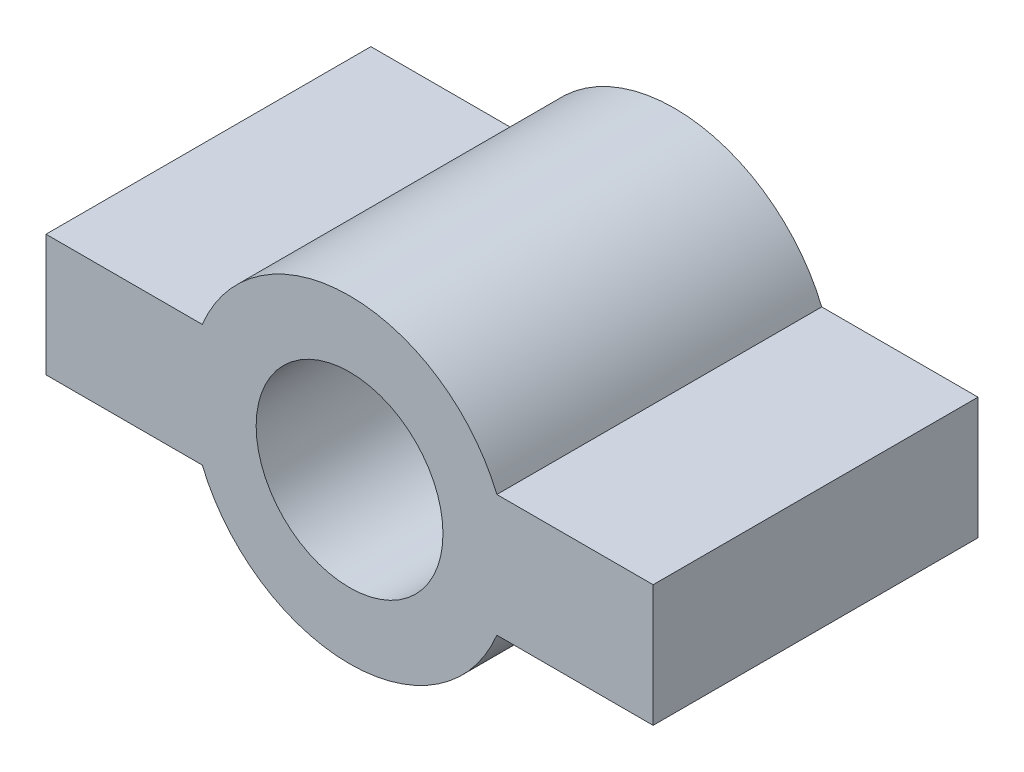
ISO-10303-21;
HEADER;
FILE_DESCRIPTION(('STEP AP214'),'2;1');
FILE_NAME('part.step','',(''),(''),'','','');
FILE_SCHEMA(('AUTOMOTIVE_DESIGN { 1 0 10303 214 1 1 1 1 }'));
ENDSEC;
DATA;
#1=APPLICATION_CONTEXT('core data for automotive mechanical design processes');
#2=APPLICATION_PROTOCOL_DEFINITION('international standard','automotive_design',2000,#1);
#3=PRODUCT_CONTEXT('',#1,'mechanical');
#4=PRODUCT('Part','Part','',(#3));
#5=PRODUCT_RELATED_PRODUCT_CATEGORY('part','',(#4));
#6=PRODUCT_DEFINITION_FORMATION('','',#4);
#7=PRODUCT_DEFINITION_CONTEXT('part definition',#1,'design');
#8=PRODUCT_DEFINITION('design','',#6,#7);
#9=PRODUCT_DEFINITION_SHAPE('','',#8);
#10=(LENGTH_UNIT() NAMED_UNIT(*) SI_UNIT(.MILLI.,.METRE.));
#11=(NAMED_UNIT(*) PLANE_ANGLE_UNIT() SI_UNIT($,.RADIAN.));
#12=(NAMED_UNIT(*) SI_UNIT($,.STERADIAN.) SOLID_ANGLE_UNIT());
#13=UNCERTAINTY_MEASURE_WITH_UNIT(LENGTH_MEASURE(1.E-05),#10,'distance_accuracy_value','');
#14=(GEOMETRIC_REPRESENTATION_CONTEXT(3) GLOBAL_UNCERTAINTY_ASSIGNED_CONTEXT((#13)) GLOBAL_UNIT_ASSIGNED_CONTEXT((#10,
#11,#12)) REPRESENTATION_CONTEXT('',''));
#15=CARTESIAN_POINT('',(0.,0.,0.));
#16=DIRECTION('',(0.,0.,1.));
#17=DIRECTION('',(1.,0.,0.));
#18=AXIS2_PLACEMENT_3D('',#15,#16,#17);
#19=CARTESIAN_POINT('',(0.,0.,-8.));
#20=DIRECTION('',(0.,0.,1.));
#21=DIRECTION('',(1.,0.,0.));
#22=AXIS2_PLACEMENT_3D('',#19,#20,#21);
#23=CYLINDRICAL_SURFACE('',#22,3.925);
#24=CARTESIAN_POINT('',(0.,0.,0.));
#25=DIRECTION('',(0.,0.,1.));
#26=DIRECTION('',(1.,0.,0.));
#27=AXIS2_PLACEMENT_3D('',#24,#25,#26);
#28=CIRCLE('',#27,3.925);
#29=CARTESIAN_POINT('',(3.62706837542388,1.5,0.));
#30=VERTEX_POINT('',#29);
#31=CARTESIAN_POINT('',(-3.62706837542388,1.5,0.));
#32=VERTEX_POINT('',#31);
#33=EDGE_CURVE('E146',#30,#32,#28,.T.);
#34=ORIENTED_EDGE('',*,*,#33,.F.);
#35=DIRECTION('',(0.,0.,1.));
#36=VECTOR('',#35,1.);
#37=CARTESIAN_POINT('',(3.62706837542388,1.5,-8.));
#38=LINE('',#37,#36);
#39=CARTESIAN_POINT('',(3.62706837542388,1.5,-8.));
#40=VERTEX_POINT('',#39);
#41=EDGE_CURVE('E11',#40,#30,#38,.T.);
#42=ORIENTED_EDGE('',*,*,#41,.F.);
#43=CARTESIAN_POINT('',(0.,0.,-8.));
#44=DIRECTION('',(0.,0.,1.));
#45=DIRECTION('',(1.,0.,0.));
#46=AXIS2_PLACEMENT_3D('',#43,#44,#45);
#47=CIRCLE('',#46,3.925);
#48=CARTESIAN_POINT('',(-3.62706837542388,1.5,-8.));
#49=VERTEX_POINT('',#48);
#50=EDGE_CURVE('E175',#40,#49,#47,.T.);
#51=ORIENTED_EDGE('',*,*,#50,.T.);
#52=DIRECTION('',(0.,0.,1.));
#53=VECTOR('',#52,1.);
#54=CARTESIAN_POINT('',(-3.62706837542388,1.5,-8.));
#55=LINE('',#54,#53);
#56=EDGE_CURVE('E46',#49,#32,#55,.T.);
#57=ORIENTED_EDGE('',*,*,#56,.T.);
#58=EDGE_LOOP('',(#34,#42,#51,#57));
#59=FACE_BOUND('',#58,.T.);
#60=ADVANCED_FACE('F43',(#59),#23,.T.);
#61=CARTESIAN_POINT('',(3.62706837542388,1.5,-8.));
#62=DIRECTION('',(0.,1.,0.));
#63=DIRECTION('',(-1.,0.,0.));
#64=AXIS2_PLACEMENT_3D('',#61,#62,#63);
#65=PLANE('',#64);
#66=DIRECTION('',(-1.,0.,0.));
#67=VECTOR('',#66,1.);
#68=CARTESIAN_POINT('',(3.62706837542388,1.5,0.));
#69=LINE('',#68,#67);
#70=CARTESIAN_POINT('',(7.475,1.5,0.));
#71=VERTEX_POINT('',#70);
#72=EDGE_CURVE('E172',#71,#30,#69,.T.);
#73=ORIENTED_EDGE('',*,*,#72,.F.);
#74=DIRECTION('',(0.,0.,1.));
#75=VECTOR('',#74,1.);
#76=CARTESIAN_POINT('',(7.475,1.5,-8.));
#77=LINE('',#76,#75);
#78=CARTESIAN_POINT('',(7.475,1.5,-8.));
#79=VERTEX_POINT('',#78);
#80=EDGE_CURVE('E53',#79,#71,#77,.T.);
#81=ORIENTED_EDGE('',*,*,#80,.F.);
#82=DIRECTION('',(-1.,0.,0.));
#83=VECTOR('',#82,1.);
#84=CARTESIAN_POINT('',(3.62706837542388,1.5,-8.));
#85=LINE('',#84,#83);
#86=EDGE_CURVE('E132',#79,#40,#85,.T.);
#87=ORIENTED_EDGE('',*,*,#86,.T.);
#88=ORIENTED_EDGE('',*,*,#41,.T.);
#89=EDGE_LOOP('',(#73,#81,#87,#88));
#90=FACE_BOUND('',#89,.T.);
#91=ADVANCED_FACE('F193',(#90),#65,.T.);
#92=CARTESIAN_POINT('',(7.475,1.5,-8.));
#93=DIRECTION('',(1.,0.,0.));
#94=DIRECTION('',(0.,0.,-1.));
#95=AXIS2_PLACEMENT_3D('',#92,#93,#94);
#96=PLANE('',#95);
#97=DIRECTION('',(0.,1.,0.));
#98=VECTOR('',#97,1.);
#99=CARTESIAN_POINT('',(7.475,1.5,0.));
#100=LINE('',#99,#98);
#101=CARTESIAN_POINT('',(7.475,-1.5,0.));
#102=VERTEX_POINT('',#101);
#103=EDGE_CURVE('E118',#102,#71,#100,.T.);
#104=ORIENTED_EDGE('',*,*,#103,.F.);
#105=DIRECTION('',(0.,0.,1.));
#106=VECTOR('',#105,1.);
#107=CARTESIAN_POINT('',(7.475,-1.5,-8.));
#108=LINE('',#107,#106);
#109=CARTESIAN_POINT('',(7.475,-1.5,-8.));
#110=VERTEX_POINT('',#109);
#111=EDGE_CURVE('E113',#110,#102,#108,.T.);
#112=ORIENTED_EDGE('',*,*,#111,.F.);
#113=DIRECTION('',(0.,1.,0.));
#114=VECTOR('',#113,1.);
#115=CARTESIAN_POINT('',(7.475,1.5,-8.));
#116=LINE('',#115,#114);
#117=EDGE_CURVE('E116',#110,#79,#116,.T.);
#118=ORIENTED_EDGE('',*,*,#117,.T.);
#119=ORIENTED_EDGE('',*,*,#80,.T.);
#120=EDGE_LOOP('',(#104,#112,#118,#119));
#121=FACE_BOUND('',#120,.T.);
#122=ADVANCED_FACE('F115',(#121),#96,.T.);
#123=CARTESIAN_POINT('',(7.475,-1.5,-8.));
#124=DIRECTION('',(0.,-1.,0.));
#125=DIRECTION('',(1.,0.,0.));
#126=AXIS2_PLACEMENT_3D('',#123,#124,#125);
#127=PLANE('',#126);
#128=DIRECTION('',(1.,0.,0.));
#129=VECTOR('',#128,1.);
#130=CARTESIAN_POINT('',(7.475,-1.5,0.));
#131=LINE('',#130,#129);
#132=CARTESIAN_POINT('',(3.62706837542388,-1.5,0.));
#133=VERTEX_POINT('',#132);
#134=EDGE_CURVE('E167',#133,#102,#131,.T.);
#135=ORIENTED_EDGE('',*,*,#134,.F.);
#136=DIRECTION('',(0.,0.,1.));
#137=VECTOR('',#136,1.);
#138=CARTESIAN_POINT('',(3.62706837542388,-1.5,-8.));
#139=LINE('',#138,#137);
#140=CARTESIAN_POINT('',(3.62706837542388,-1.5,-8.));
#141=VERTEX_POINT('',#140);
#142=EDGE_CURVE('E124',#141,#133,#139,.T.);
#143=ORIENTED_EDGE('',*,*,#142,.F.);
#144=DIRECTION('',(1.,0.,0.));
#145=VECTOR('',#144,1.);
#146=CARTESIAN_POINT('',(7.475,-1.5,-8.));
#147=LINE('',#146,#145);
#148=EDGE_CURVE('E130',#141,#110,#147,.T.);
#149=ORIENTED_EDGE('',*,*,#148,.T.);
#150=ORIENTED_EDGE('',*,*,#111,.T.);
#151=EDGE_LOOP('',(#135,#143,#149,#150));
#152=FACE_BOUND('',#151,.T.);
#153=ADVANCED_FACE('F135',(#152),#127,.T.);
#154=CARTESIAN_POINT('',(0.,0.,-8.));
#155=DIRECTION('',(0.,0.,1.));
#156=DIRECTION('',(1.,0.,0.));
#157=AXIS2_PLACEMENT_3D('',#154,#155,#156);
#158=CYLINDRICAL_SURFACE('',#157,3.925);
#159=CARTESIAN_POINT('',(0.,0.,0.));
#160=DIRECTION('',(0.,0.,1.));
#161=DIRECTION('',(1.,0.,0.));
#162=AXIS2_PLACEMENT_3D('',#159,#160,#161);
#163=CIRCLE('',#162,3.925);
#164=CARTESIAN_POINT('',(-3.62706837542388,-1.5,0.));
#165=VERTEX_POINT('',#164);
#166=EDGE_CURVE('E163',#165,#133,#163,.T.);
#167=ORIENTED_EDGE('',*,*,#166,.F.);
#168=DIRECTION('',(0.,0.,1.));
#169=VECTOR('',#168,1.);
#170=CARTESIAN_POINT('',(-3.62706837542388,-1.5,-8.));
#171=LINE('',#170,#169);
#172=CARTESIAN_POINT('',(-3.62706837542388,-1.5,-8.));
#173=VERTEX_POINT('',#172);
#174=EDGE_CURVE('E181',#173,#165,#171,.T.);
#175=ORIENTED_EDGE('',*,*,#174,.F.);
#176=CARTESIAN_POINT('',(0.,0.,-8.));
#177=DIRECTION('',(0.,0.,1.));
#178=DIRECTION('',(1.,0.,0.));
#179=AXIS2_PLACEMENT_3D('',#176,#177,#178);
#180=CIRCLE('',#179,3.925);
#181=EDGE_CURVE('E137',#173,#141,#180,.T.);
#182=ORIENTED_EDGE('',*,*,#181,.T.);
#183=ORIENTED_EDGE('',*,*,#142,.T.);
#184=EDGE_LOOP('',(#167,#175,#182,#183));
#185=FACE_BOUND('',#184,.T.);
#186=ADVANCED_FACE('F206',(#185),#158,.T.);
#187=CARTESIAN_POINT('',(-7.475,-1.5,-8.));
#188=DIRECTION('',(0.,-1.,0.));
#189=DIRECTION('',(1.,0.,0.));
#190=AXIS2_PLACEMENT_3D('',#187,#188,#189);
#191=PLANE('',#190);
#192=DIRECTION('',(1.,0.,0.));
#193=VECTOR('',#192,1.);
#194=CARTESIAN_POINT('',(-7.475,-1.5,0.));
#195=LINE('',#194,#193);
#196=CARTESIAN_POINT('',(-7.475,-1.5,0.));
#197=VERTEX_POINT('',#196);
#198=EDGE_CURVE('E159',#197,#165,#195,.T.);
#199=ORIENTED_EDGE('',*,*,#198,.F.);
#200=DIRECTION('',(0.,0.,1.));
#201=VECTOR('',#200,1.);
#202=CARTESIAN_POINT('',(-7.475,-1.5,-8.));
#203=LINE('',#202,#201);
#204=CARTESIAN_POINT('',(-7.475,-1.5,-8.));
#205=VERTEX_POINT('',#204);
#206=EDGE_CURVE('E184',#205,#197,#203,.T.);
#207=ORIENTED_EDGE('',*,*,#206,.F.);
#208=DIRECTION('',(1.,0.,0.));
#209=VECTOR('',#208,1.);
#210=CARTESIAN_POINT('',(-7.475,-1.5,-8.));
#211=LINE('',#210,#209);
#212=EDGE_CURVE('E140',#205,#173,#211,.T.);
#213=ORIENTED_EDGE('',*,*,#212,.T.);
#214=ORIENTED_EDGE('',*,*,#174,.T.);
#215=EDGE_LOOP('',(#199,#207,#213,#214));
#216=FACE_BOUND('',#215,.T.);
#217=ADVANCED_FACE('F209',(#216),#191,.T.);
#218=CARTESIAN_POINT('',(-7.475,1.5,-8.));
#219=DIRECTION('',(-1.,0.,0.));
#220=DIRECTION('',(0.,0.,1.));
#221=AXIS2_PLACEMENT_3D('',#218,#219,#220);
#222=PLANE('',#221);
#223=DIRECTION('',(0.,-1.,0.));
#224=VECTOR('',#223,1.);
#225=CARTESIAN_POINT('',(-7.475,1.5,0.));
#226=LINE('',#225,#224);
#227=CARTESIAN_POINT('',(-7.475,1.5,0.));
#228=VERTEX_POINT('',#227);
#229=EDGE_CURVE('E155',#228,#197,#226,.T.);
#230=ORIENTED_EDGE('',*,*,#229,.F.);
#231=DIRECTION('',(0.,0.,1.));
#232=VECTOR('',#231,1.);
#233=CARTESIAN_POINT('',(-7.475,1.5,-8.));
#234=LINE('',#233,#232);
#235=CARTESIAN_POINT('',(-7.475,1.5,-8.));
#236=VERTEX_POINT('',#235);
#237=EDGE_CURVE('E186',#236,#228,#234,.T.);
#238=ORIENTED_EDGE('',*,*,#237,.F.);
#239=DIRECTION('',(0.,-1.,0.));
#240=VECTOR('',#239,1.);
#241=CARTESIAN_POINT('',(-7.475,1.5,-8.));
#242=LINE('',#241,#240);
#243=EDGE_CURVE('E248',#236,#205,#242,.T.);
#244=ORIENTED_EDGE('',*,*,#243,.T.);
#245=ORIENTED_EDGE('',*,*,#206,.T.);
#246=EDGE_LOOP('',(#230,#238,#244,#245));
#247=FACE_BOUND('',#246,.T.);
#248=ADVANCED_FACE('F213',(#247),#222,.T.);
#249=CARTESIAN_POINT('',(-3.62706837542388,1.5,-8.));
#250=DIRECTION('',(0.,1.,0.));
#251=DIRECTION('',(-1.,0.,0.));
#252=AXIS2_PLACEMENT_3D('',#249,#250,#251);
#253=PLANE('',#252);
#254=DIRECTION('',(-1.,0.,0.));
#255=VECTOR('',#254,1.);
#256=CARTESIAN_POINT('',(-3.62706837542388,1.5,0.));
#257=LINE('',#256,#255);
#258=EDGE_CURVE('E150',#32,#228,#257,.T.);
#259=ORIENTED_EDGE('',*,*,#258,.F.);
#260=ORIENTED_EDGE('',*,*,#56,.F.);
#261=DIRECTION('',(-1.,0.,0.));
#262=VECTOR('',#261,1.);
#263=CARTESIAN_POINT('',(-3.62706837542388,1.5,-8.));
#264=LINE('',#263,#262);
#265=EDGE_CURVE('E245',#49,#236,#264,.T.);
#266=ORIENTED_EDGE('',*,*,#265,.T.);
#267=ORIENTED_EDGE('',*,*,#237,.T.);
#268=EDGE_LOOP('',(#259,#260,#266,#267));
#269=FACE_BOUND('',#268,.T.);
#270=ADVANCED_FACE('F190',(#269),#253,.T.);
#271=CARTESIAN_POINT('',(0.,0.,-8.));
#272=DIRECTION('',(0.,0.,1.));
#273=DIRECTION('',(1.,0.,0.));
#274=AXIS2_PLACEMENT_3D('',#271,#272,#273);
#275=PLANE('',#274);
#276=CARTESIAN_POINT('',(0.,0.,-8.));
#277=DIRECTION('',(0.,0.,1.));
#278=DIRECTION('',(1.,0.,0.));
#279=AXIS2_PLACEMENT_3D('',#276,#277,#278);
#280=CIRCLE('',#279,2.3);
#281=CARTESIAN_POINT('',(2.3,0.,-8.));
#282=VERTEX_POINT('',#281);
#283=EDGE_CURVE('E151',#282,#282,#280,.T.);
#284=ORIENTED_EDGE('',*,*,#283,.T.);
#285=EDGE_LOOP('',(#284));
#286=FACE_BOUND('',#285,.T.);
#287=ORIENTED_EDGE('',*,*,#50,.F.);
#288=ORIENTED_EDGE('',*,*,#86,.F.);
#289=ORIENTED_EDGE('',*,*,#117,.F.);
#290=ORIENTED_EDGE('',*,*,#148,.F.);
#291=ORIENTED_EDGE('',*,*,#181,.F.);
#292=ORIENTED_EDGE('',*,*,#212,.F.);
#293=ORIENTED_EDGE('',*,*,#243,.F.);
#294=ORIENTED_EDGE('',*,*,#265,.F.);
#295=EDGE_LOOP('',(#287,#288,#289,#290,#291,#292,#293,#294));
#296=FACE_BOUND('',#295,.T.);
#297=ADVANCED_FACE('F128',(#286,#296),#275,.F.);
#298=CARTESIAN_POINT('',(0.,0.,0.));
#299=DIRECTION('',(0.,0.,1.));
#300=DIRECTION('',(1.,0.,0.));
#301=AXIS2_PLACEMENT_3D('',#298,#299,#300);
#302=PLANE('',#301);
#303=CARTESIAN_POINT('',(0.,0.,0.));
#304=DIRECTION('',(0.,0.,1.));
#305=DIRECTION('',(1.,0.,0.));
#306=AXIS2_PLACEMENT_3D('',#303,#304,#305);
#307=CIRCLE('',#306,2.3);
#308=CARTESIAN_POINT('',(2.3,0.,0.));
#309=VERTEX_POINT('',#308);
#310=EDGE_CURVE('E237',#309,#309,#307,.T.);
#311=ORIENTED_EDGE('',*,*,#310,.F.);
#312=EDGE_LOOP('',(#311));
#313=FACE_BOUND('',#312,.T.);
#314=ORIENTED_EDGE('',*,*,#33,.T.);
#315=ORIENTED_EDGE('',*,*,#258,.T.);
#316=ORIENTED_EDGE('',*,*,#229,.T.);
#317=ORIENTED_EDGE('',*,*,#198,.T.);
#318=ORIENTED_EDGE('',*,*,#166,.T.);
#319=ORIENTED_EDGE('',*,*,#134,.T.);
#320=ORIENTED_EDGE('',*,*,#103,.T.);
#321=ORIENTED_EDGE('',*,*,#72,.T.);
#322=EDGE_LOOP('',(#314,#315,#316,#317,#318,#319,#320,#321));
#323=FACE_BOUND('',#322,.T.);
#324=ADVANCED_FACE('F192',(#313,#323),#302,.T.);
#325=CARTESIAN_POINT('',(0.,0.,-8.));
#326=DIRECTION('',(0.,0.,1.));
#327=DIRECTION('',(1.,0.,0.));
#328=AXIS2_PLACEMENT_3D('',#325,#326,#327);
#329=CYLINDRICAL_SURFACE('',#328,2.3);
#330=ORIENTED_EDGE('',*,*,#283,.F.);
#331=EDGE_LOOP('',(#330));
#332=FACE_BOUND('',#331,.T.);
#333=ORIENTED_EDGE('',*,*,#310,.T.);
#334=EDGE_LOOP('',(#333));
#335=FACE_BOUND('',#334,.T.);
#336=ADVANCED_FACE('F225',(#332,#335),#329,.F.);
#337=CLOSED_SHELL('',(#60,#91,#122,#153,#186,#217,#248,#270,#297,#324,#336));
#338=MANIFOLD_SOLID_BREP('B2',#337);
#339=ADVANCED_BREP_SHAPE_REPRESENTATION('',(#18,#338),#14);
#340=SHAPE_DEFINITION_REPRESENTATION(#9,#339);
ENDSEC;
END-ISO-10303-21;
